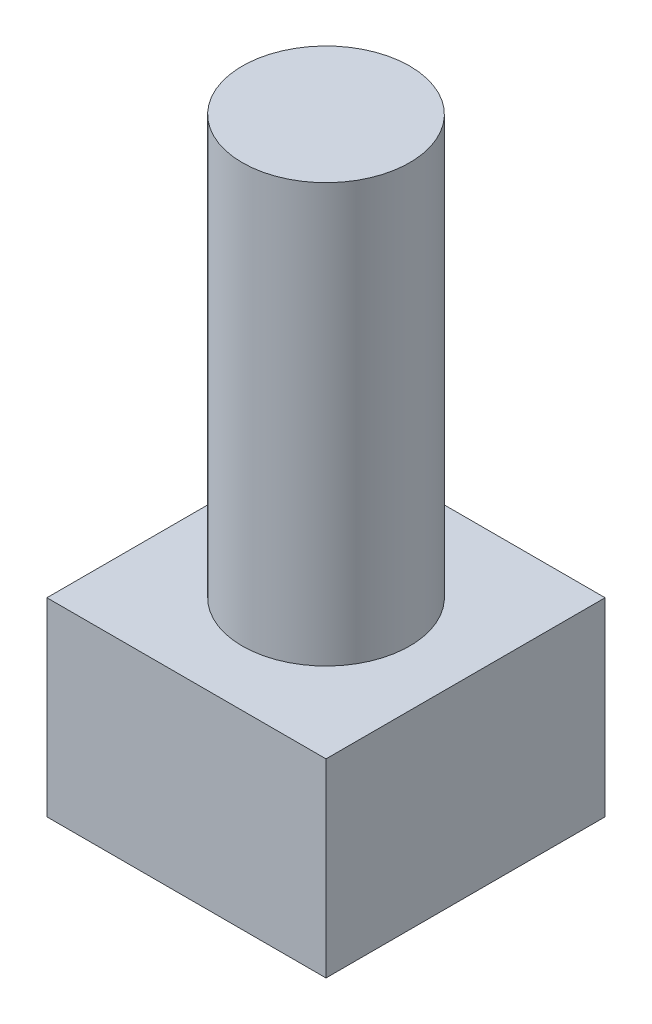
ISO-10303-21;
HEADER;
FILE_DESCRIPTION(('STEP AP214'),'2;1');
FILE_NAME('part.step','',(''),(''),'','','');
FILE_SCHEMA(('AUTOMOTIVE_DESIGN { 1 0 10303 214 1 1 1 1 }'));
ENDSEC;
DATA;
#1=APPLICATION_CONTEXT('core data for automotive mechanical design processes');
#2=APPLICATION_PROTOCOL_DEFINITION('international standard','automotive_design',2000,#1);
#3=PRODUCT_CONTEXT('',#1,'mechanical');
#4=PRODUCT('Part','Part','',(#3));
#5=PRODUCT_RELATED_PRODUCT_CATEGORY('part','',(#4));
#6=PRODUCT_DEFINITION_FORMATION('','',#4);
#7=PRODUCT_DEFINITION_CONTEXT('part definition',#1,'design');
#8=PRODUCT_DEFINITION('design','',#6,#7);
#9=PRODUCT_DEFINITION_SHAPE('','',#8);
#10=(LENGTH_UNIT() NAMED_UNIT(*) SI_UNIT(.MILLI.,.METRE.));
#11=(NAMED_UNIT(*) PLANE_ANGLE_UNIT() SI_UNIT($,.RADIAN.));
#12=(NAMED_UNIT(*) SI_UNIT($,.STERADIAN.) SOLID_ANGLE_UNIT());
#13=UNCERTAINTY_MEASURE_WITH_UNIT(LENGTH_MEASURE(1.E-05),#10,'distance_accuracy_value','');
#14=(GEOMETRIC_REPRESENTATION_CONTEXT(3) GLOBAL_UNCERTAINTY_ASSIGNED_CONTEXT((#13)) GLOBAL_UNIT_ASSIGNED_CONTEXT((#10,
#11,#12)) REPRESENTATION_CONTEXT('',''));
#15=CARTESIAN_POINT('',(0.,0.,0.));
#16=DIRECTION('',(0.,0.,1.));
#17=DIRECTION('',(1.,0.,0.));
#18=AXIS2_PLACEMENT_3D('',#15,#16,#17);
#19=CARTESIAN_POINT('',(5.,6.8,-5.));
#20=DIRECTION('',(-1.,0.,0.));
#21=DIRECTION('',(0.,0.,1.));
#22=AXIS2_PLACEMENT_3D('',#19,#20,#21);
#23=PLANE('',#22);
#24=DIRECTION('',(0.,0.,-1.));
#25=VECTOR('',#24,1.);
#26=CARTESIAN_POINT('',(5.,0.,-5.));
#27=LINE('',#26,#25);
#28=CARTESIAN_POINT('',(5.,0.,5.));
#29=VERTEX_POINT('',#28);
#30=CARTESIAN_POINT('',(5.,0.,-5.));
#31=VERTEX_POINT('',#30);
#32=EDGE_CURVE('E99',#29,#31,#27,.T.);
#33=ORIENTED_EDGE('',*,*,#32,.T.);
#34=DIRECTION('',(0.,-1.,0.));
#35=VECTOR('',#34,1.);
#36=CARTESIAN_POINT('',(5.,6.8,-5.));
#37=LINE('',#36,#35);
#38=CARTESIAN_POINT('',(5.,6.8,-5.));
#39=VERTEX_POINT('',#38);
#40=EDGE_CURVE('E36',#39,#31,#37,.T.);
#41=ORIENTED_EDGE('',*,*,#40,.F.);
#42=DIRECTION('',(0.,0.,-1.));
#43=VECTOR('',#42,1.);
#44=CARTESIAN_POINT('',(5.,6.8,-5.));
#45=LINE('',#44,#43);
#46=CARTESIAN_POINT('',(5.,6.8,5.));
#47=VERTEX_POINT('',#46);
#48=EDGE_CURVE('E86',#47,#39,#45,.T.);
#49=ORIENTED_EDGE('',*,*,#48,.F.);
#50=DIRECTION('',(0.,-1.,0.));
#51=VECTOR('',#50,1.);
#52=CARTESIAN_POINT('',(5.,6.8,5.));
#53=LINE('',#52,#51);
#54=EDGE_CURVE('E95',#47,#29,#53,.T.);
#55=ORIENTED_EDGE('',*,*,#54,.T.);
#56=EDGE_LOOP('',(#33,#41,#49,#55));
#57=FACE_BOUND('',#56,.T.);
#58=ADVANCED_FACE('F33',(#57),#23,.F.);
#59=CARTESIAN_POINT('',(-5.,6.8,-5.));
#60=DIRECTION('',(0.,0.,1.));
#61=DIRECTION('',(1.,0.,0.));
#62=AXIS2_PLACEMENT_3D('',#59,#60,#61);
#63=PLANE('',#62);
#64=DIRECTION('',(-1.,0.,0.));
#65=VECTOR('',#64,1.);
#66=CARTESIAN_POINT('',(-5.,0.,-5.));
#67=LINE('',#66,#65);
#68=CARTESIAN_POINT('',(-5.,0.,-5.));
#69=VERTEX_POINT('',#68);
#70=EDGE_CURVE('E91',#31,#69,#67,.T.);
#71=ORIENTED_EDGE('',*,*,#70,.T.);
#72=DIRECTION('',(0.,-1.,0.));
#73=VECTOR('',#72,1.);
#74=CARTESIAN_POINT('',(-5.,6.8,-5.));
#75=LINE('',#74,#73);
#76=CARTESIAN_POINT('',(-5.,6.8,-5.));
#77=VERTEX_POINT('',#76);
#78=EDGE_CURVE('E89',#77,#69,#75,.T.);
#79=ORIENTED_EDGE('',*,*,#78,.F.);
#80=DIRECTION('',(-1.,0.,0.));
#81=VECTOR('',#80,1.);
#82=CARTESIAN_POINT('',(-5.,6.8,-5.));
#83=LINE('',#82,#81);
#84=EDGE_CURVE('E81',#39,#77,#83,.T.);
#85=ORIENTED_EDGE('',*,*,#84,.F.);
#86=ORIENTED_EDGE('',*,*,#40,.T.);
#87=EDGE_LOOP('',(#71,#79,#85,#86));
#88=FACE_BOUND('',#87,.T.);
#89=ADVANCED_FACE('F90',(#88),#63,.F.);
#90=CARTESIAN_POINT('',(-5.,6.8,-5.));
#91=DIRECTION('',(1.,0.,0.));
#92=DIRECTION('',(0.,0.,-1.));
#93=AXIS2_PLACEMENT_3D('',#90,#91,#92);
#94=PLANE('',#93);
#95=DIRECTION('',(0.,0.,1.));
#96=VECTOR('',#95,1.);
#97=CARTESIAN_POINT('',(-5.,0.,-5.));
#98=LINE('',#97,#96);
#99=CARTESIAN_POINT('',(-5.,0.,5.));
#100=VERTEX_POINT('',#99);
#101=EDGE_CURVE('E67',#69,#100,#98,.T.);
#102=ORIENTED_EDGE('',*,*,#101,.T.);
#103=DIRECTION('',(0.,-1.,0.));
#104=VECTOR('',#103,1.);
#105=CARTESIAN_POINT('',(-5.,6.8,5.));
#106=LINE('',#105,#104);
#107=CARTESIAN_POINT('',(-5.,6.8,5.));
#108=VERTEX_POINT('',#107);
#109=EDGE_CURVE('E92',#108,#100,#106,.T.);
#110=ORIENTED_EDGE('',*,*,#109,.F.);
#111=DIRECTION('',(0.,0.,1.));
#112=VECTOR('',#111,1.);
#113=CARTESIAN_POINT('',(-5.,6.8,-5.));
#114=LINE('',#113,#112);
#115=EDGE_CURVE('E84',#77,#108,#114,.T.);
#116=ORIENTED_EDGE('',*,*,#115,.F.);
#117=ORIENTED_EDGE('',*,*,#78,.T.);
#118=EDGE_LOOP('',(#102,#110,#116,#117));
#119=FACE_BOUND('',#118,.T.);
#120=ADVANCED_FACE('F93',(#119),#94,.F.);
#121=CARTESIAN_POINT('',(-5.,6.8,5.));
#122=DIRECTION('',(0.,0.,-1.));
#123=DIRECTION('',(-1.,0.,0.));
#124=AXIS2_PLACEMENT_3D('',#121,#122,#123);
#125=PLANE('',#124);
#126=DIRECTION('',(1.,0.,0.));
#127=VECTOR('',#126,1.);
#128=CARTESIAN_POINT('',(-5.,0.,5.));
#129=LINE('',#128,#127);
#130=EDGE_CURVE('E73',#100,#29,#129,.T.);
#131=ORIENTED_EDGE('',*,*,#130,.T.);
#132=ORIENTED_EDGE('',*,*,#54,.F.);
#133=DIRECTION('',(1.,0.,0.));
#134=VECTOR('',#133,1.);
#135=CARTESIAN_POINT('',(-5.,6.8,5.));
#136=LINE('',#135,#134);
#137=EDGE_CURVE('E50',#108,#47,#136,.T.);
#138=ORIENTED_EDGE('',*,*,#137,.F.);
#139=ORIENTED_EDGE('',*,*,#109,.T.);
#140=EDGE_LOOP('',(#131,#132,#138,#139));
#141=FACE_BOUND('',#140,.T.);
#142=ADVANCED_FACE('F107',(#141),#125,.F.);
#143=CARTESIAN_POINT('',(0.,6.8,0.));
#144=DIRECTION('',(0.,1.,0.));
#145=DIRECTION('',(0.,0.,1.));
#146=AXIS2_PLACEMENT_3D('',#143,#144,#145);
#147=PLANE('',#146);
#148=CARTESIAN_POINT('',(0.,6.8,0.));
#149=DIRECTION('',(0.,1.,0.));
#150=DIRECTION('',(0.,0.,1.));
#151=AXIS2_PLACEMENT_3D('',#148,#149,#150);
#152=CIRCLE('',#151,3.);
#153=CARTESIAN_POINT('',(0.,6.8,3.));
#154=VERTEX_POINT('',#153);
#155=EDGE_CURVE('E11',#154,#154,#152,.T.);
#156=ORIENTED_EDGE('',*,*,#155,.F.);
#157=EDGE_LOOP('',(#156));
#158=FACE_BOUND('',#157,.T.);
#159=ORIENTED_EDGE('',*,*,#48,.T.);
#160=ORIENTED_EDGE('',*,*,#84,.T.);
#161=ORIENTED_EDGE('',*,*,#115,.T.);
#162=ORIENTED_EDGE('',*,*,#137,.T.);
#163=EDGE_LOOP('',(#159,#160,#161,#162));
#164=FACE_BOUND('',#163,.T.);
#165=ADVANCED_FACE('F82',(#158,#164),#147,.T.);
#166=CARTESIAN_POINT('',(0.,0.,0.));
#167=DIRECTION('',(0.,1.,0.));
#168=DIRECTION('',(0.,0.,1.));
#169=AXIS2_PLACEMENT_3D('',#166,#167,#168);
#170=PLANE('',#169);
#171=ORIENTED_EDGE('',*,*,#32,.F.);
#172=ORIENTED_EDGE('',*,*,#130,.F.);
#173=ORIENTED_EDGE('',*,*,#101,.F.);
#174=ORIENTED_EDGE('',*,*,#70,.F.);
#175=EDGE_LOOP('',(#171,#172,#173,#174));
#176=FACE_BOUND('',#175,.T.);
#177=ADVANCED_FACE('F110',(#176),#170,.F.);
#178=CARTESIAN_POINT('',(0.,21.8,0.));
#179=DIRECTION('',(0.,-1.,0.));
#180=DIRECTION('',(0.,0.,-1.));
#181=AXIS2_PLACEMENT_3D('',#178,#179,#180);
#182=CYLINDRICAL_SURFACE('',#181,3.);
#183=CARTESIAN_POINT('',(0.,21.8,0.));
#184=DIRECTION('',(0.,1.,0.));
#185=DIRECTION('',(0.,0.,1.));
#186=AXIS2_PLACEMENT_3D('',#183,#184,#185);
#187=CIRCLE('',#186,3.);
#188=CARTESIAN_POINT('',(0.,21.8,3.));
#189=VERTEX_POINT('',#188);
#190=EDGE_CURVE('E102',#189,#189,#187,.T.);
#191=ORIENTED_EDGE('',*,*,#190,.F.);
#192=EDGE_LOOP('',(#191));
#193=FACE_BOUND('',#192,.T.);
#194=ORIENTED_EDGE('',*,*,#155,.T.);
#195=EDGE_LOOP('',(#194));
#196=FACE_BOUND('',#195,.T.);
#197=ADVANCED_FACE('F118',(#193,#196),#182,.T.);
#198=CARTESIAN_POINT('',(0.,21.8,0.));
#199=DIRECTION('',(0.,1.,0.));
#200=DIRECTION('',(0.,0.,1.));
#201=AXIS2_PLACEMENT_3D('',#198,#199,#200);
#202=PLANE('',#201);
#203=ORIENTED_EDGE('',*,*,#190,.T.);
#204=EDGE_LOOP('',(#203));
#205=FACE_BOUND('',#204,.T.);
#206=ADVANCED_FACE('F116',(#205),#202,.T.);
#207=CLOSED_SHELL('',(#58,#89,#120,#142,#165,#177,#197,#206));
#208=MANIFOLD_SOLID_BREP('B2',#207);
#209=ADVANCED_BREP_SHAPE_REPRESENTATION('',(#18,#208),#14);
#210=SHAPE_DEFINITION_REPRESENTATION(#9,#209);
ENDSEC;
END-ISO-10303-21;
